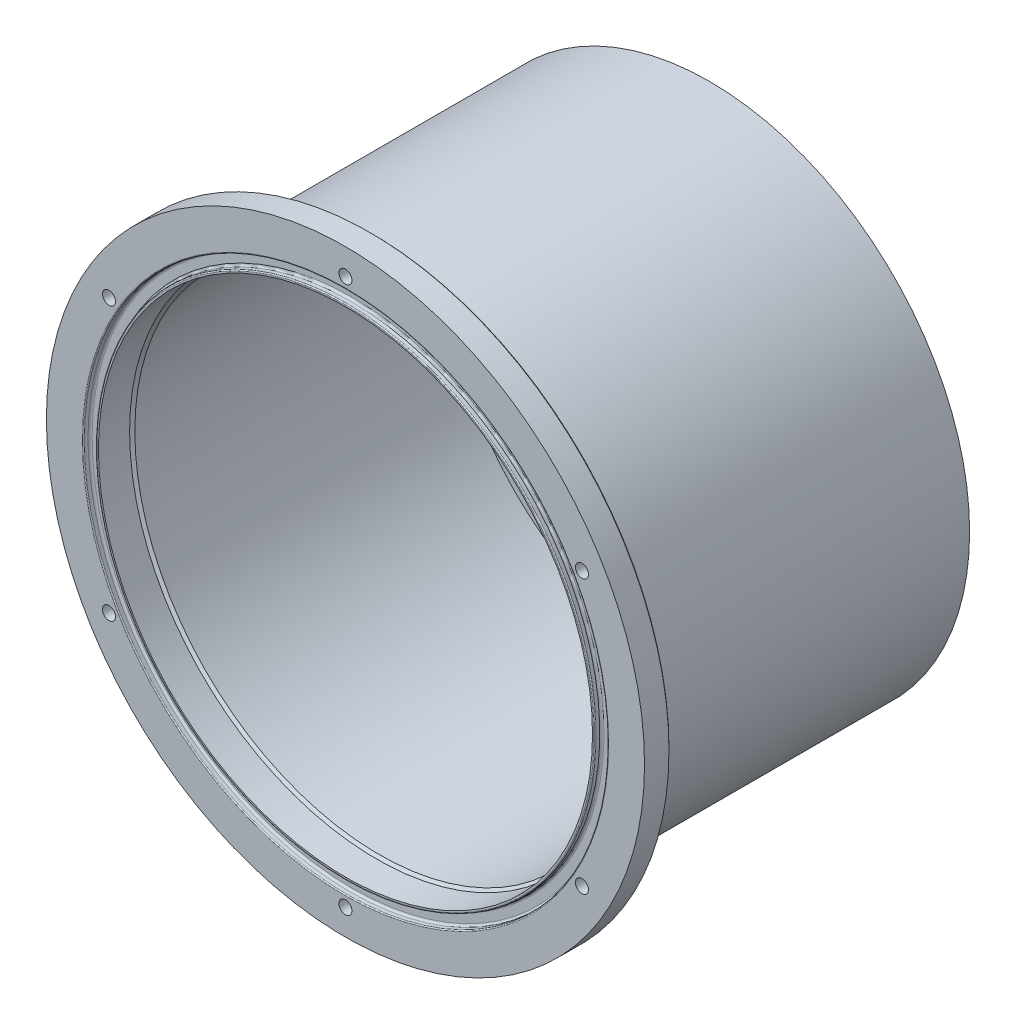
ISO-10303-21;
HEADER;
FILE_DESCRIPTION(('STEP AP214'),'2;1');
FILE_NAME('part.step','',(''),(''),'','','');
FILE_SCHEMA(('AUTOMOTIVE_DESIGN { 1 0 10303 214 1 1 1 1 }'));
ENDSEC;
DATA;
#1=APPLICATION_CONTEXT('core data for automotive mechanical design processes');
#2=APPLICATION_PROTOCOL_DEFINITION('international standard','automotive_design',2000,#1);
#3=PRODUCT_CONTEXT('',#1,'mechanical');
#4=PRODUCT('Part','Part','',(#3));
#5=PRODUCT_RELATED_PRODUCT_CATEGORY('part','',(#4));
#6=PRODUCT_DEFINITION_FORMATION('','',#4);
#7=PRODUCT_DEFINITION_CONTEXT('part definition',#1,'design');
#8=PRODUCT_DEFINITION('design','',#6,#7);
#9=PRODUCT_DEFINITION_SHAPE('','',#8);
#10=(LENGTH_UNIT() NAMED_UNIT(*) SI_UNIT(.MILLI.,.METRE.));
#11=(NAMED_UNIT(*) PLANE_ANGLE_UNIT() SI_UNIT($,.RADIAN.));
#12=(NAMED_UNIT(*) SI_UNIT($,.STERADIAN.) SOLID_ANGLE_UNIT());
#13=UNCERTAINTY_MEASURE_WITH_UNIT(LENGTH_MEASURE(1.E-05),#10,'distance_accuracy_value','');
#14=(GEOMETRIC_REPRESENTATION_CONTEXT(3) GLOBAL_UNCERTAINTY_ASSIGNED_CONTEXT((#13)) GLOBAL_UNIT_ASSIGNED_CONTEXT((#10,
#11,#12)) REPRESENTATION_CONTEXT('',''));
#15=CARTESIAN_POINT('',(0.,0.,0.));
#16=DIRECTION('',(0.,0.,1.));
#17=DIRECTION('',(1.,0.,0.));
#18=AXIS2_PLACEMENT_3D('',#15,#16,#17);
#19=CARTESIAN_POINT('',(400.,40.3538680377993,-40.446131962196));
#20=DIRECTION('',(0.,0.,1.));
#21=DIRECTION('',(1.,0.,0.));
#22=AXIS2_PLACEMENT_3D('',#19,#20,#21);
#23=CYLINDRICAL_SURFACE('',#22,57.5);
#24=CARTESIAN_POINT('',(400.,40.3538680377993,-40.146131962196));
#25=DIRECTION('',(0.,0.,1.));
#26=DIRECTION('',(-1.,0.,0.));
#27=AXIS2_PLACEMENT_3D('',#24,#25,#26);
#28=CIRCLE('',#27,57.5);
#29=CARTESIAN_POINT('',(342.5,40.3538680377993,-40.146131962196));
#30=VERTEX_POINT('',#29);
#31=EDGE_CURVE('E168',#30,#30,#28,.F.);
#32=ORIENTED_EDGE('',*,*,#31,.F.);
#33=EDGE_LOOP('',(#32));
#34=FACE_BOUND('',#33,.T.);
#35=CARTESIAN_POINT('',(400.,40.3538680377993,-35.446131962196));
#36=DIRECTION('',(0.,0.,1.));
#37=DIRECTION('',(-1.,0.,0.));
#38=AXIS2_PLACEMENT_3D('',#35,#36,#37);
#39=CIRCLE('',#38,57.5);
#40=CARTESIAN_POINT('',(342.5,40.3538680377993,-35.446131962196));
#41=VERTEX_POINT('',#40);
#42=EDGE_CURVE('E198',#41,#41,#39,.T.);
#43=ORIENTED_EDGE('',*,*,#42,.F.);
#44=EDGE_LOOP('',(#43));
#45=FACE_BOUND('',#44,.T.);
#46=ADVANCED_FACE('F17',(#34,#45),#23,.T.);
#47=CARTESIAN_POINT('',(400.,40.3538680377993,-40.446131962196));
#48=DIRECTION('',(0.,0.,-1.));
#49=DIRECTION('',(-1.,0.,0.));
#50=AXIS2_PLACEMENT_3D('',#47,#48,#49);
#51=PLANE('',#50);
#52=CARTESIAN_POINT('',(445.466333698684,14.1038680377993,-40.4461319621961));
#53=DIRECTION('',(0.,0.,1.));
#54=DIRECTION('',(-1.,0.,0.));
#55=AXIS2_PLACEMENT_3D('',#52,#53,#54);
#56=CIRCLE('',#55,1.25);
#57=CARTESIAN_POINT('',(444.216333698684,14.1038680377993,-40.4461319621961));
#58=VERTEX_POINT('',#57);
#59=EDGE_CURVE('E464',#58,#58,#56,.T.);
#60=ORIENTED_EDGE('',*,*,#59,.T.);
#61=EDGE_LOOP('',(#60));
#62=FACE_BOUND('',#61,.T.);
#63=CARTESIAN_POINT('',(445.466333698684,66.6038680377992,-40.446131962196));
#64=DIRECTION('',(0.,0.,1.));
#65=DIRECTION('',(-1.,0.,0.));
#66=AXIS2_PLACEMENT_3D('',#63,#64,#65);
#67=CIRCLE('',#66,1.25);
#68=CARTESIAN_POINT('',(444.216333698684,66.6038680377992,-40.446131962196));
#69=VERTEX_POINT('',#68);
#70=EDGE_CURVE('E469',#69,#69,#67,.T.);
#71=ORIENTED_EDGE('',*,*,#70,.T.);
#72=EDGE_LOOP('',(#71));
#73=FACE_BOUND('',#72,.T.);
#74=CARTESIAN_POINT('',(400.,92.8538680377992,-40.446131962196));
#75=DIRECTION('',(0.,0.,1.));
#76=DIRECTION('',(-1.,0.,0.));
#77=AXIS2_PLACEMENT_3D('',#74,#75,#76);
#78=CIRCLE('',#77,1.25);
#79=CARTESIAN_POINT('',(398.75,92.8538680377992,-40.446131962196));
#80=VERTEX_POINT('',#79);
#81=EDGE_CURVE('E475',#80,#80,#78,.T.);
#82=ORIENTED_EDGE('',*,*,#81,.T.);
#83=EDGE_LOOP('',(#82));
#84=FACE_BOUND('',#83,.T.);
#85=CARTESIAN_POINT('',(354.533666301318,66.6038680377993,-40.446131962196));
#86=DIRECTION('',(0.,0.,1.));
#87=DIRECTION('',(-1.,0.,0.));
#88=AXIS2_PLACEMENT_3D('',#85,#86,#87);
#89=CIRCLE('',#88,1.25);
#90=CARTESIAN_POINT('',(353.283666301318,66.6038680377993,-40.446131962196));
#91=VERTEX_POINT('',#90);
#92=EDGE_CURVE('E481',#91,#91,#89,.T.);
#93=ORIENTED_EDGE('',*,*,#92,.T.);
#94=EDGE_LOOP('',(#93));
#95=FACE_BOUND('',#94,.T.);
#96=CARTESIAN_POINT('',(354.533666301318,14.1038680377993,-40.4461319621961));
#97=DIRECTION('',(0.,0.,1.));
#98=DIRECTION('',(-1.,0.,0.));
#99=AXIS2_PLACEMENT_3D('',#96,#97,#98);
#100=CIRCLE('',#99,1.25);
#101=CARTESIAN_POINT('',(353.283666301318,14.1038680377993,-40.4461319621961));
#102=VERTEX_POINT('',#101);
#103=EDGE_CURVE('E160',#102,#102,#100,.T.);
#104=ORIENTED_EDGE('',*,*,#103,.T.);
#105=EDGE_LOOP('',(#104));
#106=FACE_BOUND('',#105,.T.);
#107=CARTESIAN_POINT('',(400.,40.3538680377993,-40.446131962196));
#108=DIRECTION('',(0.,0.,1.));
#109=DIRECTION('',(-1.,0.,0.));
#110=AXIS2_PLACEMENT_3D('',#107,#108,#109);
#111=CIRCLE('',#110,50.);
#112=CARTESIAN_POINT('',(350.,40.3538680377993,-40.446131962196));
#113=VERTEX_POINT('',#112);
#114=EDGE_CURVE('E26',#113,#113,#111,.T.);
#115=ORIENTED_EDGE('',*,*,#114,.T.);
#116=EDGE_LOOP('',(#115));
#117=FACE_BOUND('',#116,.T.);
#118=CARTESIAN_POINT('',(400.,-12.1461319622007,-40.4461319621961));
#119=DIRECTION('',(0.,0.,1.));
#120=DIRECTION('',(-1.,0.,0.));
#121=AXIS2_PLACEMENT_3D('',#118,#119,#120);
#122=CIRCLE('',#121,1.25);
#123=CARTESIAN_POINT('',(398.75,-12.1461319622007,-40.4461319621961));
#124=VERTEX_POINT('',#123);
#125=EDGE_CURVE('E171',#124,#124,#122,.T.);
#126=ORIENTED_EDGE('',*,*,#125,.T.);
#127=EDGE_LOOP('',(#126));
#128=FACE_BOUND('',#127,.T.);
#129=CARTESIAN_POINT('',(400.,40.3538680377993,-40.446131962196));
#130=DIRECTION('',(0.,0.,1.));
#131=DIRECTION('',(-1.,0.,0.));
#132=AXIS2_PLACEMENT_3D('',#129,#130,#131);
#133=CIRCLE('',#132,57.2);
#134=CARTESIAN_POINT('',(342.8,40.3538680377993,-40.446131962196));
#135=VERTEX_POINT('',#134);
#136=EDGE_CURVE('E201',#135,#135,#133,.T.);
#137=ORIENTED_EDGE('',*,*,#136,.F.);
#138=EDGE_LOOP('',(#137));
#139=FACE_BOUND('',#138,.T.);
#140=ADVANCED_FACE('F212',(#62,#73,#84,#95,#106,#117,#128,#139),#51,.T.);
#141=CARTESIAN_POINT('',(400.,40.3538680377993,-35.446131962196));
#142=DIRECTION('',(0.,0.,-1.));
#143=DIRECTION('',(-1.,0.,0.));
#144=AXIS2_PLACEMENT_3D('',#141,#142,#143);
#145=PLANE('',#144);
#146=CARTESIAN_POINT('',(445.466333698684,14.1038680377993,-35.446131962196));
#147=DIRECTION('',(0.,0.,1.));
#148=DIRECTION('',(0.866025403784439,-0.5,0.));
#149=AXIS2_PLACEMENT_3D('',#146,#147,#148);
#150=CIRCLE('',#149,1.25);
#151=CARTESIAN_POINT('',(446.548865453414,13.4788680377993,-35.446131962196));
#152=VERTEX_POINT('',#151);
#153=EDGE_CURVE('E34',#152,#152,#150,.T.);
#154=ORIENTED_EDGE('',*,*,#153,.F.);
#155=EDGE_LOOP('',(#154));
#156=FACE_BOUND('',#155,.T.);
#157=CARTESIAN_POINT('',(445.466333698684,66.6038680377992,-35.446131962196));
#158=DIRECTION('',(0.,0.,1.));
#159=DIRECTION('',(0.866025403784438,0.5,0.));
#160=AXIS2_PLACEMENT_3D('',#157,#158,#159);
#161=CIRCLE('',#160,1.25);
#162=CARTESIAN_POINT('',(446.548865453414,67.2288680377992,-35.446131962196));
#163=VERTEX_POINT('',#162);
#164=EDGE_CURVE('E40',#163,#163,#161,.T.);
#165=ORIENTED_EDGE('',*,*,#164,.F.);
#166=EDGE_LOOP('',(#165));
#167=FACE_BOUND('',#166,.T.);
#168=CARTESIAN_POINT('',(400.,92.8538680377992,-35.4461319621959));
#169=DIRECTION('',(0.,0.,1.));
#170=DIRECTION('',(0.,1.,0.));
#171=AXIS2_PLACEMENT_3D('',#168,#169,#170);
#172=CIRCLE('',#171,1.25);
#173=CARTESIAN_POINT('',(400.,94.1038680377992,-35.4461319621959));
#174=VERTEX_POINT('',#173);
#175=EDGE_CURVE('E472',#174,#174,#172,.T.);
#176=ORIENTED_EDGE('',*,*,#175,.F.);
#177=EDGE_LOOP('',(#176));
#178=FACE_BOUND('',#177,.T.);
#179=CARTESIAN_POINT('',(354.533666301318,66.6038680377993,-35.446131962196));
#180=DIRECTION('',(0.,0.,1.));
#181=DIRECTION('',(-0.866025403784439,0.5,0.));
#182=AXIS2_PLACEMENT_3D('',#179,#180,#181);
#183=CIRCLE('',#182,1.25);
#184=CARTESIAN_POINT('',(353.451134546587,67.2288680377993,-35.446131962196));
#185=VERTEX_POINT('',#184);
#186=EDGE_CURVE('E478',#185,#185,#183,.T.);
#187=ORIENTED_EDGE('',*,*,#186,.F.);
#188=EDGE_LOOP('',(#187));
#189=FACE_BOUND('',#188,.T.);
#190=CARTESIAN_POINT('',(354.533666301318,14.1038680377993,-35.446131962196));
#191=DIRECTION('',(0.,0.,1.));
#192=DIRECTION('',(-0.866025403784439,-0.5,0.));
#193=AXIS2_PLACEMENT_3D('',#190,#191,#192);
#194=CIRCLE('',#193,1.25);
#195=CARTESIAN_POINT('',(353.451134546587,13.4788680377993,-35.446131962196));
#196=VERTEX_POINT('',#195);
#197=EDGE_CURVE('E484',#196,#196,#194,.T.);
#198=ORIENTED_EDGE('',*,*,#197,.F.);
#199=EDGE_LOOP('',(#198));
#200=FACE_BOUND('',#199,.T.);
#201=CARTESIAN_POINT('',(400.,-12.1461319622007,-35.446131962196));
#202=DIRECTION('',(0.,0.,1.));
#203=DIRECTION('',(0.,-1.,0.));
#204=AXIS2_PLACEMENT_3D('',#201,#202,#203);
#205=CIRCLE('',#204,1.25);
#206=CARTESIAN_POINT('',(400.,-13.3961319622007,-35.446131962196));
#207=VERTEX_POINT('',#206);
#208=EDGE_CURVE('E165',#207,#207,#205,.T.);
#209=ORIENTED_EDGE('',*,*,#208,.F.);
#210=EDGE_LOOP('',(#209));
#211=FACE_BOUND('',#210,.T.);
#212=CARTESIAN_POINT('',(400.,40.3538680377995,-35.4461319622538));
#213=DIRECTION('',(0.,0.,-1.));
#214=DIRECTION('',(0.,1.,0.));
#215=AXIS2_PLACEMENT_3D('',#212,#213,#214);
#216=CIRCLE('',#215,50.6000000002734);
#217=CARTESIAN_POINT('',(400.,90.9538680380728,-35.4461319622538));
#218=VERTEX_POINT('',#217);
#219=EDGE_CURVE('E174',#218,#218,#216,.T.);
#220=ORIENTED_EDGE('',*,*,#219,.T.);
#221=EDGE_LOOP('',(#220));
#222=FACE_BOUND('',#221,.T.);
#223=ORIENTED_EDGE('',*,*,#42,.T.);
#224=EDGE_LOOP('',(#223));
#225=FACE_BOUND('',#224,.T.);
#226=ADVANCED_FACE('F216',(#156,#167,#178,#189,#200,#211,#222,#225),#145,.F.);
#227=CARTESIAN_POINT('',(400.,40.3538680377993,-40.446131962196));
#228=DIRECTION('',(0.,0.,1.));
#229=DIRECTION('',(1.,0.,0.));
#230=AXIS2_PLACEMENT_3D('',#227,#228,#229);
#231=CONICAL_SURFACE('',#230,57.2,0.785398163397451);
#232=ORIENTED_EDGE('',*,*,#31,.T.);
#233=EDGE_LOOP('',(#232));
#234=FACE_BOUND('',#233,.T.);
#235=ORIENTED_EDGE('',*,*,#136,.T.);
#236=EDGE_LOOP('',(#235));
#237=FACE_BOUND('',#236,.T.);
#238=ADVANCED_FACE('F207',(#234,#237),#231,.T.);
#239=CARTESIAN_POINT('',(400.,40.3538680377995,-35.6461319622926));
#240=DIRECTION('',(0.,0.,1.));
#241=DIRECTION('',(0.,1.,0.));
#242=AXIS2_PLACEMENT_3D('',#239,#240,#241);
#243=TOROIDAL_SURFACE('',#242,47.7999999999039,0.200000000096218);
#244=CARTESIAN_POINT('',(400.,40.3538680377995,-35.6461319622571));
#245=DIRECTION('',(0.,0.,-1.));
#246=DIRECTION('',(0.,1.,0.));
#247=AXIS2_PLACEMENT_3D('',#244,#245,#246);
#248=CIRCLE('',#247,48.);
#249=CARTESIAN_POINT('',(400.,88.3538680377996,-35.6461319622571));
#250=VERTEX_POINT('',#249);
#251=EDGE_CURVE('E192',#250,#250,#248,.T.);
#252=ORIENTED_EDGE('',*,*,#251,.F.);
#253=EDGE_LOOP('',(#252));
#254=FACE_BOUND('',#253,.T.);
#255=CARTESIAN_POINT('',(400.,40.3538680377995,-35.4461319621963));
#256=DIRECTION('',(0.,0.,-1.));
#257=DIRECTION('',(0.,1.,0.));
#258=AXIS2_PLACEMENT_3D('',#255,#256,#257);
#259=CIRCLE('',#258,47.7999999998966);
#260=CARTESIAN_POINT('',(400.,88.1538680376961,-35.4461319621963));
#261=VERTEX_POINT('',#260);
#262=EDGE_CURVE('E195',#261,#261,#259,.T.);
#263=ORIENTED_EDGE('',*,*,#262,.T.);
#264=EDGE_LOOP('',(#263));
#265=FACE_BOUND('',#264,.T.);
#266=ADVANCED_FACE('F225',(#254,#265),#243,.T.);
#267=CARTESIAN_POINT('',(400.,40.3538680377995,-35.4461319621962));
#268=DIRECTION('',(0.,0.,1.));
#269=DIRECTION('',(0.,1.,0.));
#270=AXIS2_PLACEMENT_3D('',#267,#268,#269);
#271=CYLINDRICAL_SURFACE('',#270,47.9999999999987);
#272=CARTESIAN_POINT('',(400.,40.3538680377995,-36.3461319623336));
#273=DIRECTION('',(0.,0.,-1.));
#274=DIRECTION('',(0.,1.,0.));
#275=AXIS2_PLACEMENT_3D('',#272,#273,#274);
#276=CIRCLE('',#275,47.9999999999974);
#277=CARTESIAN_POINT('',(400.,88.3538680377969,-36.3461319623335));
#278=VERTEX_POINT('',#277);
#279=EDGE_CURVE('E189',#278,#278,#276,.T.);
#280=ORIENTED_EDGE('',*,*,#279,.F.);
#281=EDGE_LOOP('',(#280));
#282=FACE_BOUND('',#281,.T.);
#283=ORIENTED_EDGE('',*,*,#251,.T.);
#284=EDGE_LOOP('',(#283));
#285=FACE_BOUND('',#284,.T.);
#286=ADVANCED_FACE('F263',(#282,#285),#271,.T.);
#287=CARTESIAN_POINT('',(400.,40.3538680377995,-36.3461319623333));
#288=DIRECTION('',(0.,0.,1.));
#289=DIRECTION('',(0.,1.,0.));
#290=AXIS2_PLACEMENT_3D('',#287,#288,#289);
#291=TOROIDAL_SURFACE('',#290,48.3999999998605,0.399999999863066);
#292=CARTESIAN_POINT('',(400.,40.3538680377995,-36.7461319621964));
#293=DIRECTION('',(0.,0.,-1.));
#294=DIRECTION('',(0.,1.,0.));
#295=AXIS2_PLACEMENT_3D('',#292,#293,#294);
#296=CIRCLE('',#295,48.4000000002921);
#297=CARTESIAN_POINT('',(400.,88.7538680380916,-36.7461319621964));
#298=VERTEX_POINT('',#297);
#299=EDGE_CURVE('E186',#298,#298,#296,.T.);
#300=ORIENTED_EDGE('',*,*,#299,.F.);
#301=EDGE_LOOP('',(#300));
#302=FACE_BOUND('',#301,.T.);
#303=ORIENTED_EDGE('',*,*,#279,.T.);
#304=EDGE_LOOP('',(#303));
#305=FACE_BOUND('',#304,.T.);
#306=ADVANCED_FACE('F259',(#302,#305),#291,.F.);
#307=CARTESIAN_POINT('',(351.599999999708,40.3538680377995,-36.7461319621962));
#308=DIRECTION('',(0.,0.,1.));
#309=DIRECTION('',(0.,1.,0.));
#310=AXIS2_PLACEMENT_3D('',#307,#308,#309);
#311=PLANE('',#310);
#312=CARTESIAN_POINT('',(400.,40.3538680377995,-36.7461319621962));
#313=DIRECTION('',(0.,0.,-1.));
#314=DIRECTION('',(0.,1.,0.));
#315=AXIS2_PLACEMENT_3D('',#312,#313,#314);
#316=CIRCLE('',#315,50.0000000000247);
#317=CARTESIAN_POINT('',(400.,90.3538680378242,-36.7461319621961));
#318=VERTEX_POINT('',#317);
#319=EDGE_CURVE('E183',#318,#318,#316,.T.);
#320=ORIENTED_EDGE('',*,*,#319,.F.);
#321=EDGE_LOOP('',(#320));
#322=FACE_BOUND('',#321,.T.);
#323=ORIENTED_EDGE('',*,*,#299,.T.);
#324=EDGE_LOOP('',(#323));
#325=FACE_BOUND('',#324,.T.);
#326=ADVANCED_FACE('F255',(#322,#325),#311,.T.);
#327=CARTESIAN_POINT('',(400.,40.3538680377995,-36.3461319623471));
#328=DIRECTION('',(0.,0.,1.));
#329=DIRECTION('',(0.,1.,0.));
#330=AXIS2_PLACEMENT_3D('',#327,#328,#329);
#331=TOROIDAL_SURFACE('',#330,50.0000000001507,0.399999999849023);
#332=CARTESIAN_POINT('',(400.,40.3538680377995,-36.3461319622642));
#333=DIRECTION('',(0.,0.,-1.));
#334=DIRECTION('',(0.,1.,0.));
#335=AXIS2_PLACEMENT_3D('',#332,#333,#334);
#336=CIRCLE('',#335,50.4);
#337=CARTESIAN_POINT('',(400.,90.7538680377992,-36.3461319622642));
#338=VERTEX_POINT('',#337);
#339=EDGE_CURVE('E180',#338,#338,#336,.T.);
#340=ORIENTED_EDGE('',*,*,#339,.F.);
#341=EDGE_LOOP('',(#340));
#342=FACE_BOUND('',#341,.T.);
#343=ORIENTED_EDGE('',*,*,#319,.T.);
#344=EDGE_LOOP('',(#343));
#345=FACE_BOUND('',#344,.T.);
#346=ADVANCED_FACE('F246',(#342,#345),#331,.F.);
#347=CARTESIAN_POINT('',(400.,40.3538680377995,-35.4461319621962));
#348=DIRECTION('',(0.,0.,1.));
#349=DIRECTION('',(0.,1.,0.));
#350=AXIS2_PLACEMENT_3D('',#347,#348,#349);
#351=CYLINDRICAL_SURFACE('',#350,50.4);
#352=CARTESIAN_POINT('',(400.,40.3538680377995,-35.6461319619804));
#353=DIRECTION('',(0.,0.,-1.));
#354=DIRECTION('',(0.,1.,0.));
#355=AXIS2_PLACEMENT_3D('',#352,#353,#354);
#356=CIRCLE('',#355,50.4);
#357=CARTESIAN_POINT('',(400.,90.7538680377994,-35.6461319619804));
#358=VERTEX_POINT('',#357);
#359=EDGE_CURVE('E177',#358,#358,#356,.T.);
#360=ORIENTED_EDGE('',*,*,#359,.F.);
#361=EDGE_LOOP('',(#360));
#362=FACE_BOUND('',#361,.T.);
#363=ORIENTED_EDGE('',*,*,#339,.T.);
#364=EDGE_LOOP('',(#363));
#365=FACE_BOUND('',#364,.T.);
#366=ADVANCED_FACE('F240',(#362,#365),#351,.F.);
#367=CARTESIAN_POINT('',(400.,40.3538680377995,-35.6461319625284));
#368=DIRECTION('',(0.,0.,1.));
#369=DIRECTION('',(0.,1.,0.));
#370=AXIS2_PLACEMENT_3D('',#367,#368,#369);
#371=TOROIDAL_SURFACE('',#370,50.6000000002745,0.200000000274529);
#372=ORIENTED_EDGE('',*,*,#219,.F.);
#373=EDGE_LOOP('',(#372));
#374=FACE_BOUND('',#373,.T.);
#375=ORIENTED_EDGE('',*,*,#359,.T.);
#376=EDGE_LOOP('',(#375));
#377=FACE_BOUND('',#376,.T.);
#378=ADVANCED_FACE('F231',(#374,#377),#371,.T.);
#379=CARTESIAN_POINT('',(400.,40.3538680377993,-35.4461319621963));
#380=DIRECTION('',(0.,0.,-1.));
#381=DIRECTION('',(-1.,0.,0.));
#382=AXIS2_PLACEMENT_3D('',#379,#380,#381);
#383=CIRCLE('',#382,47.5);
#384=CARTESIAN_POINT('',(352.5,40.3538680377993,-35.4461319621963));
#385=VERTEX_POINT('',#384);
#386=EDGE_CURVE('E149',#385,#385,#383,.T.);
#387=ORIENTED_EDGE('',*,*,#386,.T.);
#388=EDGE_LOOP('',(#387));
#389=FACE_BOUND('',#388,.T.);
#390=ORIENTED_EDGE('',*,*,#262,.F.);
#391=EDGE_LOOP('',(#390));
#392=FACE_BOUND('',#391,.T.);
#393=ADVANCED_FACE('F150',(#389,#392),#145,.F.);
#394=CARTESIAN_POINT('',(400.,-12.1461319622007,-35.446131962196));
#395=DIRECTION('',(0.,0.,1.));
#396=DIRECTION('',(0.,-1.,0.));
#397=AXIS2_PLACEMENT_3D('',#394,#395,#396);
#398=CYLINDRICAL_SURFACE('',#397,1.25);
#399=ORIENTED_EDGE('',*,*,#125,.F.);
#400=EDGE_LOOP('',(#399));
#401=FACE_BOUND('',#400,.T.);
#402=ORIENTED_EDGE('',*,*,#208,.T.);
#403=EDGE_LOOP('',(#402));
#404=FACE_BOUND('',#403,.T.);
#405=ADVANCED_FACE('F230',(#401,#404),#398,.F.);
#406=CARTESIAN_POINT('',(400.,40.3538680377993,-105.446131962196));
#407=DIRECTION('',(0.,0.,1.));
#408=DIRECTION('',(1.,0.,0.));
#409=AXIS2_PLACEMENT_3D('',#406,#407,#408);
#410=CYLINDRICAL_SURFACE('',#409,50.);
#411=CARTESIAN_POINT('',(400.,40.3538680377993,-105.446131962196));
#412=DIRECTION('',(0.,0.,1.));
#413=DIRECTION('',(-1.,0.,0.));
#414=AXIS2_PLACEMENT_3D('',#411,#412,#413);
#415=CIRCLE('',#414,50.);
#416=CARTESIAN_POINT('',(350.,40.3538680377993,-105.446131962196));
#417=VERTEX_POINT('',#416);
#418=EDGE_CURVE('E157',#417,#417,#415,.T.);
#419=ORIENTED_EDGE('',*,*,#418,.T.);
#420=EDGE_LOOP('',(#419));
#421=FACE_BOUND('',#420,.T.);
#422=ORIENTED_EDGE('',*,*,#114,.F.);
#423=EDGE_LOOP('',(#422));
#424=FACE_BOUND('',#423,.T.);
#425=ADVANCED_FACE('F237',(#421,#424),#410,.T.);
#426=CARTESIAN_POINT('',(400.,40.3538680377993,-105.446131962196));
#427=DIRECTION('',(0.,0.,-1.));
#428=DIRECTION('',(-1.,0.,0.));
#429=AXIS2_PLACEMENT_3D('',#426,#427,#428);
#430=PLANE('',#429);
#431=ORIENTED_EDGE('',*,*,#418,.F.);
#432=EDGE_LOOP('',(#431));
#433=FACE_BOUND('',#432,.T.);
#434=ADVANCED_FACE('F333',(#433),#430,.T.);
#435=CARTESIAN_POINT('',(400.,40.3538680377993,-41.4461319621963));
#436=DIRECTION('',(0.,0.,1.));
#437=DIRECTION('',(1.,0.,0.));
#438=AXIS2_PLACEMENT_3D('',#435,#436,#437);
#439=CYLINDRICAL_SURFACE('',#438,47.5);
#440=CARTESIAN_POINT('',(400.,40.3538680377993,-41.4461319621963));
#441=DIRECTION('',(0.,0.,-1.));
#442=DIRECTION('',(-1.,0.,0.));
#443=AXIS2_PLACEMENT_3D('',#440,#441,#442);
#444=CIRCLE('',#443,47.5);
#445=CARTESIAN_POINT('',(352.5,40.3538680377993,-41.4461319621963));
#446=VERTEX_POINT('',#445);
#447=EDGE_CURVE('E153',#446,#446,#444,.T.);
#448=ORIENTED_EDGE('',*,*,#447,.T.);
#449=EDGE_LOOP('',(#448));
#450=FACE_BOUND('',#449,.T.);
#451=ORIENTED_EDGE('',*,*,#386,.F.);
#452=EDGE_LOOP('',(#451));
#453=FACE_BOUND('',#452,.T.);
#454=ADVANCED_FACE('F341',(#450,#453),#439,.F.);
#455=CARTESIAN_POINT('',(400.,40.353868037799,-21.4461319621963));
#456=DIRECTION('',(0.,0.,-1.));
#457=DIRECTION('',(1.,0.,0.));
#458=AXIS2_PLACEMENT_3D('',#455,#456,#457);
#459=CYLINDRICAL_SURFACE('',#458,47.);
#460=CARTESIAN_POINT('',(400.,40.353868037799,-41.9461319621963));
#461=DIRECTION('',(0.,0.,1.));
#462=DIRECTION('',(-1.,0.,0.));
#463=AXIS2_PLACEMENT_3D('',#460,#461,#462);
#464=CIRCLE('',#463,47.);
#465=CARTESIAN_POINT('',(353.,40.353868037799,-41.9461319621963));
#466=VERTEX_POINT('',#465);
#467=EDGE_CURVE('E11',#466,#466,#464,.F.);
#468=ORIENTED_EDGE('',*,*,#467,.F.);
#469=EDGE_LOOP('',(#468));
#470=FACE_BOUND('',#469,.T.);
#471=CARTESIAN_POINT('',(400.,40.3538680377991,-101.446131962196));
#472=DIRECTION('',(0.,0.,-1.));
#473=DIRECTION('',(-1.,0.,0.));
#474=AXIS2_PLACEMENT_3D('',#471,#472,#473);
#475=CIRCLE('',#474,47.);
#476=CARTESIAN_POINT('',(353.,40.3538680377991,-101.446131962196));
#477=VERTEX_POINT('',#476);
#478=EDGE_CURVE('E154',#477,#477,#475,.T.);
#479=ORIENTED_EDGE('',*,*,#478,.T.);
#480=EDGE_LOOP('',(#479));
#481=FACE_BOUND('',#480,.T.);
#482=ADVANCED_FACE('F350',(#470,#481),#459,.F.);
#483=CARTESIAN_POINT('',(400.,40.3538680377991,-101.446131962196));
#484=DIRECTION('',(0.,0.,1.));
#485=DIRECTION('',(-1.,0.,0.));
#486=AXIS2_PLACEMENT_3D('',#483,#484,#485);
#487=PLANE('',#486);
#488=ORIENTED_EDGE('',*,*,#478,.F.);
#489=EDGE_LOOP('',(#488));
#490=FACE_BOUND('',#489,.T.);
#491=ADVANCED_FACE('F359',(#490),#487,.T.);
#492=CARTESIAN_POINT('',(354.533666301318,14.1038680377993,-35.446131962196));
#493=DIRECTION('',(0.,0.,1.));
#494=DIRECTION('',(-0.866025403784439,-0.5,0.));
#495=AXIS2_PLACEMENT_3D('',#492,#493,#494);
#496=CYLINDRICAL_SURFACE('',#495,1.25);
#497=ORIENTED_EDGE('',*,*,#103,.F.);
#498=EDGE_LOOP('',(#497));
#499=FACE_BOUND('',#498,.T.);
#500=ORIENTED_EDGE('',*,*,#197,.T.);
#501=EDGE_LOOP('',(#500));
#502=FACE_BOUND('',#501,.T.);
#503=ADVANCED_FACE('F368',(#499,#502),#496,.F.);
#504=CARTESIAN_POINT('',(354.533666301318,66.6038680377993,-35.446131962196));
#505=DIRECTION('',(0.,0.,1.));
#506=DIRECTION('',(-0.866025403784439,0.5,0.));
#507=AXIS2_PLACEMENT_3D('',#504,#505,#506);
#508=CYLINDRICAL_SURFACE('',#507,1.25);
#509=ORIENTED_EDGE('',*,*,#92,.F.);
#510=EDGE_LOOP('',(#509));
#511=FACE_BOUND('',#510,.T.);
#512=ORIENTED_EDGE('',*,*,#186,.T.);
#513=EDGE_LOOP('',(#512));
#514=FACE_BOUND('',#513,.T.);
#515=ADVANCED_FACE('F378',(#511,#514),#508,.F.);
#516=CARTESIAN_POINT('',(400.,92.8538680377992,-35.4461319621959));
#517=DIRECTION('',(0.,0.,1.));
#518=DIRECTION('',(0.,1.,0.));
#519=AXIS2_PLACEMENT_3D('',#516,#517,#518);
#520=CYLINDRICAL_SURFACE('',#519,1.25);
#521=ORIENTED_EDGE('',*,*,#81,.F.);
#522=EDGE_LOOP('',(#521));
#523=FACE_BOUND('',#522,.T.);
#524=ORIENTED_EDGE('',*,*,#175,.T.);
#525=EDGE_LOOP('',(#524));
#526=FACE_BOUND('',#525,.T.);
#527=ADVANCED_FACE('F388',(#523,#526),#520,.F.);
#528=CARTESIAN_POINT('',(445.466333698684,66.6038680377992,-35.446131962196));
#529=DIRECTION('',(0.,0.,1.));
#530=DIRECTION('',(0.866025403784438,0.5,0.));
#531=AXIS2_PLACEMENT_3D('',#528,#529,#530);
#532=CYLINDRICAL_SURFACE('',#531,1.25);
#533=ORIENTED_EDGE('',*,*,#70,.F.);
#534=EDGE_LOOP('',(#533));
#535=FACE_BOUND('',#534,.T.);
#536=ORIENTED_EDGE('',*,*,#164,.T.);
#537=EDGE_LOOP('',(#536));
#538=FACE_BOUND('',#537,.T.);
#539=ADVANCED_FACE('F399',(#535,#538),#532,.F.);
#540=CARTESIAN_POINT('',(445.466333698684,14.1038680377993,-35.446131962196));
#541=DIRECTION('',(0.,0.,1.));
#542=DIRECTION('',(0.866025403784439,-0.5,0.));
#543=AXIS2_PLACEMENT_3D('',#540,#541,#542);
#544=CYLINDRICAL_SURFACE('',#543,1.25);
#545=ORIENTED_EDGE('',*,*,#59,.F.);
#546=EDGE_LOOP('',(#545));
#547=FACE_BOUND('',#546,.T.);
#548=ORIENTED_EDGE('',*,*,#153,.T.);
#549=EDGE_LOOP('',(#548));
#550=FACE_BOUND('',#549,.T.);
#551=ADVANCED_FACE('F410',(#547,#550),#544,.F.);
#552=CARTESIAN_POINT('',(400.,40.353868037799,-41.9461319621963));
#553=DIRECTION('',(0.,0.,1.));
#554=DIRECTION('',(1.,0.,0.));
#555=AXIS2_PLACEMENT_3D('',#552,#553,#554);
#556=CONICAL_SURFACE('',#555,47.,0.785398163397448);
#557=ORIENTED_EDGE('',*,*,#447,.F.);
#558=EDGE_LOOP('',(#557));
#559=FACE_BOUND('',#558,.T.);
#560=ORIENTED_EDGE('',*,*,#467,.T.);
#561=EDGE_LOOP('',(#560));
#562=FACE_BOUND('',#561,.T.);
#563=ADVANCED_FACE('F19',(#559,#562),#556,.F.);
#564=CLOSED_SHELL('',(#46,#140,#226,#238,#266,#286,#306,#326,#346,#366,#378,#393,#405,#425,#434,
#454,#482,#491,#503,#515,#527,#539,#551,#563));
#565=MANIFOLD_SOLID_BREP('B1',#564);
#566=ADVANCED_BREP_SHAPE_REPRESENTATION('',(#18,#565),#14);
#567=SHAPE_DEFINITION_REPRESENTATION(#9,#566);
ENDSEC;
END-ISO-10303-21;
